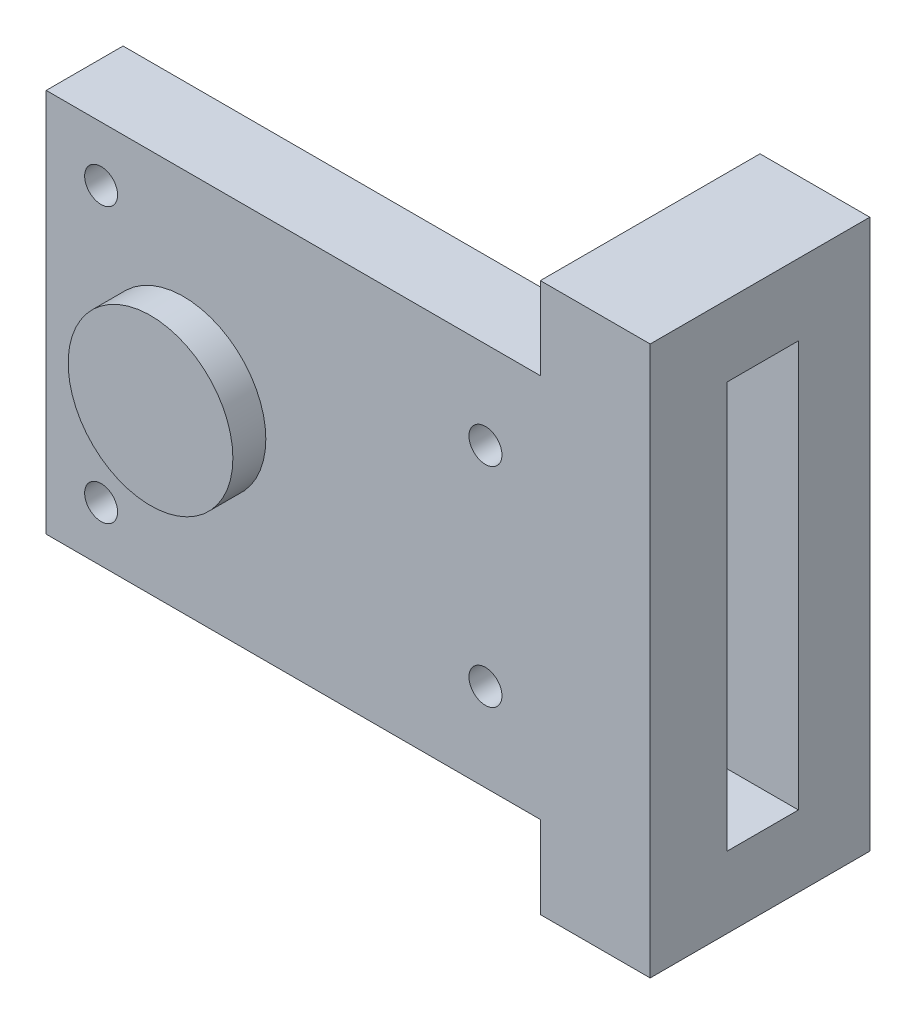
ISO-10303-21;
HEADER;
FILE_DESCRIPTION(('STEP AP214'),'2;1');
FILE_NAME('part.step','',(''),(''),'','','');
FILE_SCHEMA(('AUTOMOTIVE_DESIGN { 1 0 10303 214 1 1 1 1 }'));
ENDSEC;
DATA;
#1=APPLICATION_CONTEXT('core data for automotive mechanical design processes');
#2=APPLICATION_PROTOCOL_DEFINITION('international standard','automotive_design',2000,#1);
#3=PRODUCT_CONTEXT('',#1,'mechanical');
#4=PRODUCT('Part','Part','',(#3));
#5=PRODUCT_RELATED_PRODUCT_CATEGORY('part','',(#4));
#6=PRODUCT_DEFINITION_FORMATION('','',#4);
#7=PRODUCT_DEFINITION_CONTEXT('part definition',#1,'design');
#8=PRODUCT_DEFINITION('design','',#6,#7);
#9=PRODUCT_DEFINITION_SHAPE('','',#8);
#10=(LENGTH_UNIT() NAMED_UNIT(*) SI_UNIT(.MILLI.,.METRE.));
#11=(NAMED_UNIT(*) PLANE_ANGLE_UNIT() SI_UNIT($,.RADIAN.));
#12=(NAMED_UNIT(*) SI_UNIT($,.STERADIAN.) SOLID_ANGLE_UNIT());
#13=UNCERTAINTY_MEASURE_WITH_UNIT(LENGTH_MEASURE(1.E-05),#10,'distance_accuracy_value','');
#14=(GEOMETRIC_REPRESENTATION_CONTEXT(3) GLOBAL_UNCERTAINTY_ASSIGNED_CONTEXT((#13)) GLOBAL_UNIT_ASSIGNED_CONTEXT((#10,
#11,#12)) REPRESENTATION_CONTEXT('',''));
#15=CARTESIAN_POINT('',(0.,0.,0.));
#16=DIRECTION('',(0.,0.,1.));
#17=DIRECTION('',(1.,0.,0.));
#18=AXIS2_PLACEMENT_3D('',#15,#16,#17);
#19=CARTESIAN_POINT('',(0.,0.,0.));
#20=DIRECTION('',(0.,0.,1.));
#21=DIRECTION('',(1.,0.,0.));
#22=AXIS2_PLACEMENT_3D('',#19,#20,#21);
#23=PLANE('',#22);
#24=CARTESIAN_POINT('',(-80.0000000000005,5.96744875736022E-13,0.));
#25=DIRECTION('',(0.,0.,1.));
#26=DIRECTION('',(1.,0.,0.));
#27=AXIS2_PLACEMENT_3D('',#24,#25,#26);
#28=CIRCLE('',#27,4.25000000000001);
#29=CARTESIAN_POINT('',(-75.7500000000005,5.96744875736022E-13,0.));
#30=VERTEX_POINT('',#29);
#31=EDGE_CURVE('E546',#30,#30,#28,.T.);
#32=ORIENTED_EDGE('',*,*,#31,.T.);
#33=EDGE_LOOP('',(#32));
#34=FACE_BOUND('',#33,.T.);
#35=CARTESIAN_POINT('',(-52.5000000000001,-9.5,0.));
#36=DIRECTION('',(0.,0.,1.));
#37=DIRECTION('',(1.,0.,0.));
#38=AXIS2_PLACEMENT_3D('',#35,#36,#37);
#39=CIRCLE('',#38,1.5);
#40=CARTESIAN_POINT('',(-51.,-9.5,0.));
#41=VERTEX_POINT('',#40);
#42=EDGE_CURVE('E236',#41,#41,#39,.T.);
#43=ORIENTED_EDGE('',*,*,#42,.T.);
#44=EDGE_LOOP('',(#43));
#45=FACE_BOUND('',#44,.T.);
#46=CARTESIAN_POINT('',(-52.5000000000001,9.5,0.));
#47=DIRECTION('',(0.,0.,1.));
#48=DIRECTION('',(1.,0.,0.));
#49=AXIS2_PLACEMENT_3D('',#46,#47,#48);
#50=CIRCLE('',#49,1.5);
#51=CARTESIAN_POINT('',(-51.,9.5,0.));
#52=VERTEX_POINT('',#51);
#53=EDGE_CURVE('E268',#52,#52,#50,.T.);
#54=ORIENTED_EDGE('',*,*,#53,.T.);
#55=EDGE_LOOP('',(#54));
#56=FACE_BOUND('',#55,.T.);
#57=CARTESIAN_POINT('',(-87.5000000000001,12.5,0.));
#58=DIRECTION('',(0.,0.,1.));
#59=DIRECTION('',(1.,0.,0.));
#60=AXIS2_PLACEMENT_3D('',#57,#58,#59);
#61=CIRCLE('',#60,1.5);
#62=CARTESIAN_POINT('',(-86.,12.5,0.));
#63=VERTEX_POINT('',#62);
#64=EDGE_CURVE('E284',#63,#63,#61,.T.);
#65=ORIENTED_EDGE('',*,*,#64,.T.);
#66=EDGE_LOOP('',(#65));
#67=FACE_BOUND('',#66,.T.);
#68=CARTESIAN_POINT('',(-87.5000000000001,-12.5,0.));
#69=DIRECTION('',(0.,0.,1.));
#70=DIRECTION('',(1.,0.,0.));
#71=AXIS2_PLACEMENT_3D('',#68,#69,#70);
#72=CIRCLE('',#71,1.5);
#73=CARTESIAN_POINT('',(-86.,-12.5,0.));
#74=VERTEX_POINT('',#73);
#75=EDGE_CURVE('E242',#74,#74,#72,.F.);
#76=ORIENTED_EDGE('',*,*,#75,.F.);
#77=EDGE_LOOP('',(#76));
#78=FACE_BOUND('',#77,.T.);
#79=DIRECTION('',(1.,0.,0.));
#80=VECTOR('',#79,1.);
#81=CARTESIAN_POINT('',(-47.5000000000001,-18.5,0.));
#82=LINE('',#81,#80);
#83=CARTESIAN_POINT('',(-47.5000000000001,-18.5,0.));
#84=VERTEX_POINT('',#83);
#85=CARTESIAN_POINT('',(-37.5,-18.5,0.));
#86=VERTEX_POINT('',#85);
#87=EDGE_CURVE('E177',#84,#86,#82,.T.);
#88=ORIENTED_EDGE('',*,*,#87,.F.);
#89=DIRECTION('',(0.,1.,0.));
#90=VECTOR('',#89,1.);
#91=CARTESIAN_POINT('',(-47.5000000000001,25.,0.));
#92=LINE('',#91,#90);
#93=CARTESIAN_POINT('',(-47.5,-17.5,0.));
#94=VERTEX_POINT('',#93);
#95=EDGE_CURVE('E146',#84,#94,#92,.T.);
#96=ORIENTED_EDGE('',*,*,#95,.T.);
#97=DIRECTION('',(1.,0.,0.));
#98=VECTOR('',#97,1.);
#99=CARTESIAN_POINT('',(0.,-17.5,0.));
#100=LINE('',#99,#98);
#101=CARTESIAN_POINT('',(-92.5000000000001,-17.5,0.));
#102=VERTEX_POINT('',#101);
#103=EDGE_CURVE('E280',#102,#94,#100,.T.);
#104=ORIENTED_EDGE('',*,*,#103,.F.);
#105=DIRECTION('',(0.,-1.,0.));
#106=VECTOR('',#105,1.);
#107=CARTESIAN_POINT('',(-92.5000000000001,0.,0.));
#108=LINE('',#107,#106);
#109=CARTESIAN_POINT('',(-92.5000000000001,17.5,0.));
#110=VERTEX_POINT('',#109);
#111=EDGE_CURVE('E276',#110,#102,#108,.T.);
#112=ORIENTED_EDGE('',*,*,#111,.F.);
#113=DIRECTION('',(1.,0.,0.));
#114=VECTOR('',#113,1.);
#115=CARTESIAN_POINT('',(0.,17.5,0.));
#116=LINE('',#115,#114);
#117=CARTESIAN_POINT('',(-47.5000000000001,17.5,0.));
#118=VERTEX_POINT('',#117);
#119=EDGE_CURVE('E272',#110,#118,#116,.T.);
#120=ORIENTED_EDGE('',*,*,#119,.T.);
#121=CARTESIAN_POINT('',(-47.5000000000001,18.5,0.));
#122=VERTEX_POINT('',#121);
#123=EDGE_CURVE('E211',#118,#122,#92,.T.);
#124=ORIENTED_EDGE('',*,*,#123,.T.);
#125=DIRECTION('',(-1.,0.,0.));
#126=VECTOR('',#125,1.);
#127=CARTESIAN_POINT('',(-47.5000000000001,18.5,0.));
#128=LINE('',#127,#126);
#129=CARTESIAN_POINT('',(-37.5000000000001,18.5,0.));
#130=VERTEX_POINT('',#129);
#131=EDGE_CURVE('E195',#130,#122,#128,.T.);
#132=ORIENTED_EDGE('',*,*,#131,.F.);
#133=DIRECTION('',(0.,1.,0.));
#134=VECTOR('',#133,1.);
#135=CARTESIAN_POINT('',(-37.5000000000001,25.,0.));
#136=LINE('',#135,#134);
#137=EDGE_CURVE('E59',#86,#130,#136,.T.);
#138=ORIENTED_EDGE('',*,*,#137,.F.);
#139=EDGE_LOOP('',(#88,#96,#104,#112,#120,#124,#132,#138));
#140=FACE_BOUND('',#139,.T.);
#141=ADVANCED_FACE('F43',(#34,#45,#56,#67,#78,#140),#23,.F.);
#142=CARTESIAN_POINT('',(0.,17.5,7.));
#143=DIRECTION('',(0.,1.,0.));
#144=DIRECTION('',(0.,0.,1.));
#145=AXIS2_PLACEMENT_3D('',#142,#143,#144);
#146=PLANE('',#145);
#147=ORIENTED_EDGE('',*,*,#119,.F.);
#148=DIRECTION('',(0.,0.,-1.));
#149=VECTOR('',#148,1.);
#150=CARTESIAN_POINT('',(-92.5000000000001,17.5,7.));
#151=LINE('',#150,#149);
#152=CARTESIAN_POINT('',(-92.5000000000001,17.5,7.));
#153=VERTEX_POINT('',#152);
#154=EDGE_CURVE('E52',#153,#110,#151,.T.);
#155=ORIENTED_EDGE('',*,*,#154,.F.);
#156=DIRECTION('',(1.,0.,0.));
#157=VECTOR('',#156,1.);
#158=CARTESIAN_POINT('',(0.,17.5,7.));
#159=LINE('',#158,#157);
#160=CARTESIAN_POINT('',(-47.5000000000001,17.5,7.));
#161=VERTEX_POINT('',#160);
#162=EDGE_CURVE('E246',#153,#161,#159,.T.);
#163=ORIENTED_EDGE('',*,*,#162,.T.);
#164=DIRECTION('',(0.,0.,-1.));
#165=VECTOR('',#164,1.);
#166=CARTESIAN_POINT('',(-47.5000000000001,17.5,7.));
#167=LINE('',#166,#165);
#168=EDGE_CURVE('E11',#161,#118,#167,.T.);
#169=ORIENTED_EDGE('',*,*,#168,.T.);
#170=EDGE_LOOP('',(#147,#155,#163,#169));
#171=FACE_BOUND('',#170,.T.);
#172=ADVANCED_FACE('F307',(#171),#146,.T.);
#173=CARTESIAN_POINT('',(-92.5000000000001,0.,7.));
#174=DIRECTION('',(1.,0.,0.));
#175=DIRECTION('',(0.,0.,-1.));
#176=AXIS2_PLACEMENT_3D('',#173,#174,#175);
#177=PLANE('',#176);
#178=ORIENTED_EDGE('',*,*,#111,.T.);
#179=DIRECTION('',(0.,0.,-1.));
#180=VECTOR('',#179,1.);
#181=CARTESIAN_POINT('',(-92.5000000000001,-17.5,7.));
#182=LINE('',#181,#180);
#183=CARTESIAN_POINT('',(-92.5000000000001,-17.5,7.));
#184=VERTEX_POINT('',#183);
#185=EDGE_CURVE('E294',#184,#102,#182,.T.);
#186=ORIENTED_EDGE('',*,*,#185,.F.);
#187=DIRECTION('',(0.,-1.,0.));
#188=VECTOR('',#187,1.);
#189=CARTESIAN_POINT('',(-92.5000000000001,0.,7.));
#190=LINE('',#189,#188);
#191=EDGE_CURVE('E249',#153,#184,#190,.T.);
#192=ORIENTED_EDGE('',*,*,#191,.F.);
#193=ORIENTED_EDGE('',*,*,#154,.T.);
#194=EDGE_LOOP('',(#178,#186,#192,#193));
#195=FACE_BOUND('',#194,.T.);
#196=ADVANCED_FACE('F301',(#195),#177,.F.);
#197=CARTESIAN_POINT('',(-87.5000000000001,12.5,7.));
#198=DIRECTION('',(0.,0.,-1.));
#199=DIRECTION('',(-1.,0.,0.));
#200=AXIS2_PLACEMENT_3D('',#197,#198,#199);
#201=CYLINDRICAL_SURFACE('',#200,1.5);
#202=CARTESIAN_POINT('',(-87.5000000000001,12.5,7.));
#203=DIRECTION('',(0.,0.,1.));
#204=DIRECTION('',(1.,0.,0.));
#205=AXIS2_PLACEMENT_3D('',#202,#203,#204);
#206=CIRCLE('',#205,1.5);
#207=CARTESIAN_POINT('',(-86.,12.5,7.));
#208=VERTEX_POINT('',#207);
#209=EDGE_CURVE('E256',#208,#208,#206,.T.);
#210=ORIENTED_EDGE('',*,*,#209,.T.);
#211=EDGE_LOOP('',(#210));
#212=FACE_BOUND('',#211,.T.);
#213=ORIENTED_EDGE('',*,*,#64,.F.);
#214=EDGE_LOOP('',(#213));
#215=FACE_BOUND('',#214,.T.);
#216=ADVANCED_FACE('F335',(#212,#215),#201,.F.);
#217=CARTESIAN_POINT('',(0.,-17.5,7.));
#218=DIRECTION('',(0.,1.,0.));
#219=DIRECTION('',(0.,0.,1.));
#220=AXIS2_PLACEMENT_3D('',#217,#218,#219);
#221=PLANE('',#220);
#222=ORIENTED_EDGE('',*,*,#103,.T.);
#223=DIRECTION('',(0.,0.,-1.));
#224=VECTOR('',#223,1.);
#225=CARTESIAN_POINT('',(-47.5,-17.5,7.));
#226=LINE('',#225,#224);
#227=CARTESIAN_POINT('',(-47.5,-17.5,7.));
#228=VERTEX_POINT('',#227);
#229=EDGE_CURVE('E264',#228,#94,#226,.T.);
#230=ORIENTED_EDGE('',*,*,#229,.F.);
#231=DIRECTION('',(1.,0.,0.));
#232=VECTOR('',#231,1.);
#233=CARTESIAN_POINT('',(0.,-17.5,7.));
#234=LINE('',#233,#232);
#235=EDGE_CURVE('E253',#184,#228,#234,.T.);
#236=ORIENTED_EDGE('',*,*,#235,.F.);
#237=ORIENTED_EDGE('',*,*,#185,.T.);
#238=EDGE_LOOP('',(#222,#230,#236,#237));
#239=FACE_BOUND('',#238,.T.);
#240=ADVANCED_FACE('F332',(#239),#221,.F.);
#241=CARTESIAN_POINT('',(-52.5000000000001,9.5,7.));
#242=DIRECTION('',(0.,0.,-1.));
#243=DIRECTION('',(-1.,0.,0.));
#244=AXIS2_PLACEMENT_3D('',#241,#242,#243);
#245=CYLINDRICAL_SURFACE('',#244,1.5);
#246=CARTESIAN_POINT('',(-52.5000000000001,9.5,7.));
#247=DIRECTION('',(0.,0.,1.));
#248=DIRECTION('',(1.,0.,0.));
#249=AXIS2_PLACEMENT_3D('',#246,#247,#248);
#250=CIRCLE('',#249,1.5);
#251=CARTESIAN_POINT('',(-51.,9.5,7.));
#252=VERTEX_POINT('',#251);
#253=EDGE_CURVE('E241',#252,#252,#250,.T.);
#254=ORIENTED_EDGE('',*,*,#253,.T.);
#255=EDGE_LOOP('',(#254));
#256=FACE_BOUND('',#255,.T.);
#257=ORIENTED_EDGE('',*,*,#53,.F.);
#258=EDGE_LOOP('',(#257));
#259=FACE_BOUND('',#258,.T.);
#260=ADVANCED_FACE('F334',(#256,#259),#245,.F.);
#261=CARTESIAN_POINT('',(-52.5000000000001,-9.5,7.));
#262=DIRECTION('',(0.,0.,-1.));
#263=DIRECTION('',(-1.,0.,0.));
#264=AXIS2_PLACEMENT_3D('',#261,#262,#263);
#265=CYLINDRICAL_SURFACE('',#264,1.5);
#266=CARTESIAN_POINT('',(-52.5000000000001,-9.5,7.));
#267=DIRECTION('',(0.,0.,1.));
#268=DIRECTION('',(1.,0.,0.));
#269=AXIS2_PLACEMENT_3D('',#266,#267,#268);
#270=CIRCLE('',#269,1.5);
#271=CARTESIAN_POINT('',(-51.,-9.5,7.));
#272=VERTEX_POINT('',#271);
#273=EDGE_CURVE('E237',#272,#272,#270,.T.);
#274=ORIENTED_EDGE('',*,*,#273,.T.);
#275=EDGE_LOOP('',(#274));
#276=FACE_BOUND('',#275,.T.);
#277=ORIENTED_EDGE('',*,*,#42,.F.);
#278=EDGE_LOOP('',(#277));
#279=FACE_BOUND('',#278,.T.);
#280=ADVANCED_FACE('F45',(#276,#279),#265,.F.);
#281=CARTESIAN_POINT('',(-87.5000000000001,-12.5,7.));
#282=DIRECTION('',(0.,0.,-1.));
#283=DIRECTION('',(-1.,0.,0.));
#284=AXIS2_PLACEMENT_3D('',#281,#282,#283);
#285=CYLINDRICAL_SURFACE('',#284,1.5);
#286=CARTESIAN_POINT('',(-87.5000000000001,-12.5,7.));
#287=DIRECTION('',(0.,0.,1.));
#288=DIRECTION('',(1.,0.,0.));
#289=AXIS2_PLACEMENT_3D('',#286,#287,#288);
#290=CIRCLE('',#289,1.5);
#291=CARTESIAN_POINT('',(-86.,-12.5,7.));
#292=VERTEX_POINT('',#291);
#293=EDGE_CURVE('E260',#292,#292,#290,.F.);
#294=ORIENTED_EDGE('',*,*,#293,.F.);
#295=EDGE_LOOP('',(#294));
#296=FACE_BOUND('',#295,.T.);
#297=ORIENTED_EDGE('',*,*,#75,.T.);
#298=EDGE_LOOP('',(#297));
#299=FACE_BOUND('',#298,.T.);
#300=ADVANCED_FACE('F357',(#296,#299),#285,.F.);
#301=CARTESIAN_POINT('',(0.,0.,7.));
#302=DIRECTION('',(0.,0.,1.));
#303=DIRECTION('',(1.,0.,0.));
#304=AXIS2_PLACEMENT_3D('',#301,#302,#303);
#305=PLANE('',#304);
#306=CARTESIAN_POINT('',(-80.0000000000005,5.96744875736022E-13,7.));
#307=DIRECTION('',(0.,0.,1.));
#308=DIRECTION('',(1.,0.,0.));
#309=AXIS2_PLACEMENT_3D('',#306,#307,#308);
#310=CIRCLE('',#309,7.50000000000001);
#311=CARTESIAN_POINT('',(-72.5000000000005,5.96744875736022E-13,7.));
#312=VERTEX_POINT('',#311);
#313=EDGE_CURVE('E170',#312,#312,#310,.T.);
#314=ORIENTED_EDGE('',*,*,#313,.F.);
#315=EDGE_LOOP('',(#314));
#316=FACE_BOUND('',#315,.T.);
#317=ORIENTED_EDGE('',*,*,#273,.F.);
#318=EDGE_LOOP('',(#317));
#319=FACE_BOUND('',#318,.T.);
#320=ORIENTED_EDGE('',*,*,#253,.F.);
#321=EDGE_LOOP('',(#320));
#322=FACE_BOUND('',#321,.T.);
#323=ORIENTED_EDGE('',*,*,#235,.T.);
#324=DIRECTION('',(0.,-1.,0.));
#325=VECTOR('',#324,1.);
#326=CARTESIAN_POINT('',(-47.5000000000001,25.,7.));
#327=LINE('',#326,#325);
#328=CARTESIAN_POINT('',(-47.5,-25.,6.99999999999999));
#329=VERTEX_POINT('',#328);
#330=EDGE_CURVE('E145',#228,#329,#327,.T.);
#331=ORIENTED_EDGE('',*,*,#330,.T.);
#332=DIRECTION('',(-1.,0.,0.));
#333=VECTOR('',#332,1.);
#334=CARTESIAN_POINT('',(-37.5,-25.,6.99999999999999));
#335=LINE('',#334,#333);
#336=CARTESIAN_POINT('',(-37.5,-25.,6.99999999999999));
#337=VERTEX_POINT('',#336);
#338=EDGE_CURVE('E223',#337,#329,#335,.T.);
#339=ORIENTED_EDGE('',*,*,#338,.F.);
#340=DIRECTION('',(0.,-1.,0.));
#341=VECTOR('',#340,1.);
#342=CARTESIAN_POINT('',(-37.5000000000001,25.,7.));
#343=LINE('',#342,#341);
#344=CARTESIAN_POINT('',(-37.5000000000001,25.,7.));
#345=VERTEX_POINT('',#344);
#346=EDGE_CURVE('E217',#345,#337,#343,.T.);
#347=ORIENTED_EDGE('',*,*,#346,.F.);
#348=DIRECTION('',(-1.,0.,0.));
#349=VECTOR('',#348,1.);
#350=CARTESIAN_POINT('',(-37.5000000000001,25.,7.));
#351=LINE('',#350,#349);
#352=CARTESIAN_POINT('',(-47.5000000000001,25.,7.));
#353=VERTEX_POINT('',#352);
#354=EDGE_CURVE('E233',#345,#353,#351,.T.);
#355=ORIENTED_EDGE('',*,*,#354,.T.);
#356=EDGE_CURVE('E140',#353,#161,#327,.T.);
#357=ORIENTED_EDGE('',*,*,#356,.T.);
#358=ORIENTED_EDGE('',*,*,#162,.F.);
#359=ORIENTED_EDGE('',*,*,#191,.T.);
#360=EDGE_LOOP('',(#323,#331,#339,#347,#355,#357,#358,#359));
#361=FACE_BOUND('',#360,.T.);
#362=ORIENTED_EDGE('',*,*,#209,.F.);
#363=EDGE_LOOP('',(#362));
#364=FACE_BOUND('',#363,.T.);
#365=ORIENTED_EDGE('',*,*,#293,.T.);
#366=EDGE_LOOP('',(#365));
#367=FACE_BOUND('',#366,.T.);
#368=ADVANCED_FACE('F309',(#316,#319,#322,#361,#364,#367),#305,.T.);
#369=CARTESIAN_POINT('',(-47.5,0.,0.));
#370=DIRECTION('',(-1.,0.,0.));
#371=DIRECTION('',(0.,-1.,0.));
#372=AXIS2_PLACEMENT_3D('',#369,#370,#371);
#373=PLANE('',#372);
#374=ORIENTED_EDGE('',*,*,#168,.F.);
#375=ORIENTED_EDGE('',*,*,#356,.F.);
#376=DIRECTION('',(0.,0.,1.));
#377=VECTOR('',#376,1.);
#378=CARTESIAN_POINT('',(-47.5000000000001,25.,0.));
#379=LINE('',#378,#377);
#380=CARTESIAN_POINT('',(-47.5000000000001,25.,-13.));
#381=VERTEX_POINT('',#380);
#382=EDGE_CURVE('E132',#381,#353,#379,.T.);
#383=ORIENTED_EDGE('',*,*,#382,.F.);
#384=DIRECTION('',(0.,1.,0.));
#385=VECTOR('',#384,1.);
#386=CARTESIAN_POINT('',(-47.5000000000001,25.,-13.));
#387=LINE('',#386,#385);
#388=CARTESIAN_POINT('',(-47.5000000000001,-25.,-13.));
#389=VERTEX_POINT('',#388);
#390=EDGE_CURVE('E138',#389,#381,#387,.T.);
#391=ORIENTED_EDGE('',*,*,#390,.F.);
#392=DIRECTION('',(0.,0.,-1.));
#393=VECTOR('',#392,1.);
#394=CARTESIAN_POINT('',(-47.5,-25.,0.));
#395=LINE('',#394,#393);
#396=EDGE_CURVE('E214',#329,#389,#395,.T.);
#397=ORIENTED_EDGE('',*,*,#396,.F.);
#398=ORIENTED_EDGE('',*,*,#330,.F.);
#399=ORIENTED_EDGE('',*,*,#229,.T.);
#400=ORIENTED_EDGE('',*,*,#95,.F.);
#401=DIRECTION('',(0.,0.,1.));
#402=VECTOR('',#401,1.);
#403=CARTESIAN_POINT('',(-47.5000000000001,-18.5,-6.5));
#404=LINE('',#403,#402);
#405=CARTESIAN_POINT('',(-47.5000000000001,-18.5,-6.5));
#406=VERTEX_POINT('',#405);
#407=EDGE_CURVE('E191',#406,#84,#404,.T.);
#408=ORIENTED_EDGE('',*,*,#407,.F.);
#409=DIRECTION('',(0.,1.,0.));
#410=VECTOR('',#409,1.);
#411=CARTESIAN_POINT('',(-47.5000000000001,25.,-6.5));
#412=LINE('',#411,#410);
#413=CARTESIAN_POINT('',(-47.5000000000001,18.5,-6.5));
#414=VERTEX_POINT('',#413);
#415=EDGE_CURVE('E167',#406,#414,#412,.T.);
#416=ORIENTED_EDGE('',*,*,#415,.T.);
#417=DIRECTION('',(0.,0.,1.));
#418=VECTOR('',#417,1.);
#419=CARTESIAN_POINT('',(-47.5000000000001,18.5,-6.5));
#420=LINE('',#419,#418);
#421=EDGE_CURVE('E200',#414,#122,#420,.T.);
#422=ORIENTED_EDGE('',*,*,#421,.T.);
#423=ORIENTED_EDGE('',*,*,#123,.F.);
#424=EDGE_LOOP('',(#374,#375,#383,#391,#397,#398,#399,#400,#408,#416,#422,#423));
#425=FACE_BOUND('',#424,.T.);
#426=ADVANCED_FACE('F135',(#425),#373,.T.);
#427=CARTESIAN_POINT('',(-37.5000000000001,25.,0.));
#428=DIRECTION('',(0.,-1.,0.));
#429=DIRECTION('',(1.,0.,0.));
#430=AXIS2_PLACEMENT_3D('',#427,#428,#429);
#431=PLANE('',#430);
#432=ORIENTED_EDGE('',*,*,#382,.T.);
#433=ORIENTED_EDGE('',*,*,#354,.F.);
#434=DIRECTION('',(0.,0.,1.));
#435=VECTOR('',#434,1.);
#436=CARTESIAN_POINT('',(-37.5000000000001,25.,0.));
#437=LINE('',#436,#435);
#438=CARTESIAN_POINT('',(-37.5000000000001,25.,-13.));
#439=VERTEX_POINT('',#438);
#440=EDGE_CURVE('E151',#439,#345,#437,.T.);
#441=ORIENTED_EDGE('',*,*,#440,.F.);
#442=DIRECTION('',(1.,0.,0.));
#443=VECTOR('',#442,1.);
#444=CARTESIAN_POINT('',(-47.5000000000001,25.,-13.));
#445=LINE('',#444,#443);
#446=EDGE_CURVE('E149',#381,#439,#445,.T.);
#447=ORIENTED_EDGE('',*,*,#446,.F.);
#448=EDGE_LOOP('',(#432,#433,#441,#447));
#449=FACE_BOUND('',#448,.T.);
#450=ADVANCED_FACE('F150',(#449),#431,.F.);
#451=CARTESIAN_POINT('',(-37.5,-25.,0.));
#452=DIRECTION('',(0.,1.,0.));
#453=DIRECTION('',(0.,0.,1.));
#454=AXIS2_PLACEMENT_3D('',#451,#452,#453);
#455=PLANE('',#454);
#456=ORIENTED_EDGE('',*,*,#396,.T.);
#457=DIRECTION('',(-1.,0.,0.));
#458=VECTOR('',#457,1.);
#459=CARTESIAN_POINT('',(-47.5000000000001,-25.,-13.));
#460=LINE('',#459,#458);
#461=CARTESIAN_POINT('',(-37.5000000000001,-25.,-13.));
#462=VERTEX_POINT('',#461);
#463=EDGE_CURVE('E161',#462,#389,#460,.T.);
#464=ORIENTED_EDGE('',*,*,#463,.F.);
#465=DIRECTION('',(0.,0.,-1.));
#466=VECTOR('',#465,1.);
#467=CARTESIAN_POINT('',(-37.5,-25.,0.));
#468=LINE('',#467,#466);
#469=EDGE_CURVE('E220',#337,#462,#468,.T.);
#470=ORIENTED_EDGE('',*,*,#469,.F.);
#471=ORIENTED_EDGE('',*,*,#338,.T.);
#472=EDGE_LOOP('',(#456,#464,#470,#471));
#473=FACE_BOUND('',#472,.T.);
#474=ADVANCED_FACE('F317',(#473),#455,.F.);
#475=CARTESIAN_POINT('',(-37.5,0.,0.));
#476=DIRECTION('',(-1.,0.,0.));
#477=DIRECTION('',(0.,-1.,0.));
#478=AXIS2_PLACEMENT_3D('',#475,#476,#477);
#479=PLANE('',#478);
#480=DIRECTION('',(0.,0.,1.));
#481=VECTOR('',#480,1.);
#482=CARTESIAN_POINT('',(-37.5,18.5,-6.5));
#483=LINE('',#482,#481);
#484=CARTESIAN_POINT('',(-37.5000000000001,18.5,-6.5));
#485=VERTEX_POINT('',#484);
#486=EDGE_CURVE('E207',#485,#130,#483,.T.);
#487=ORIENTED_EDGE('',*,*,#486,.F.);
#488=DIRECTION('',(0.,-1.,0.));
#489=VECTOR('',#488,1.);
#490=CARTESIAN_POINT('',(-37.5000000000001,25.,-6.5));
#491=LINE('',#490,#489);
#492=CARTESIAN_POINT('',(-37.5,-18.5,-6.5));
#493=VERTEX_POINT('',#492);
#494=EDGE_CURVE('E163',#485,#493,#491,.T.);
#495=ORIENTED_EDGE('',*,*,#494,.T.);
#496=DIRECTION('',(0.,0.,1.));
#497=VECTOR('',#496,1.);
#498=CARTESIAN_POINT('',(-37.5,-18.5,-6.5));
#499=LINE('',#498,#497);
#500=EDGE_CURVE('E186',#493,#86,#499,.T.);
#501=ORIENTED_EDGE('',*,*,#500,.T.);
#502=ORIENTED_EDGE('',*,*,#137,.T.);
#503=EDGE_LOOP('',(#487,#495,#501,#502));
#504=FACE_BOUND('',#503,.T.);
#505=ORIENTED_EDGE('',*,*,#469,.T.);
#506=DIRECTION('',(0.,-1.,0.));
#507=VECTOR('',#506,1.);
#508=CARTESIAN_POINT('',(-37.5000000000001,25.,-13.));
#509=LINE('',#508,#507);
#510=EDGE_CURVE('E156',#439,#462,#509,.T.);
#511=ORIENTED_EDGE('',*,*,#510,.F.);
#512=ORIENTED_EDGE('',*,*,#440,.T.);
#513=ORIENTED_EDGE('',*,*,#346,.T.);
#514=EDGE_LOOP('',(#505,#511,#512,#513));
#515=FACE_BOUND('',#514,.T.);
#516=ADVANCED_FACE('F315',(#504,#515),#479,.F.);
#517=CARTESIAN_POINT('',(-47.5000000000001,18.5,-6.5));
#518=DIRECTION('',(0.,1.,0.));
#519=DIRECTION('',(-1.,0.,0.));
#520=AXIS2_PLACEMENT_3D('',#517,#518,#519);
#521=PLANE('',#520);
#522=ORIENTED_EDGE('',*,*,#131,.T.);
#523=ORIENTED_EDGE('',*,*,#421,.F.);
#524=DIRECTION('',(-1.,0.,0.));
#525=VECTOR('',#524,1.);
#526=CARTESIAN_POINT('',(-47.5000000000001,18.5,-6.5));
#527=LINE('',#526,#525);
#528=EDGE_CURVE('E196',#485,#414,#527,.T.);
#529=ORIENTED_EDGE('',*,*,#528,.F.);
#530=ORIENTED_EDGE('',*,*,#486,.T.);
#531=EDGE_LOOP('',(#522,#523,#529,#530));
#532=FACE_BOUND('',#531,.T.);
#533=ADVANCED_FACE('F323',(#532),#521,.F.);
#534=CARTESIAN_POINT('',(-47.5000000000001,-18.5,-6.5));
#535=DIRECTION('',(0.,-1.,0.));
#536=DIRECTION('',(1.,0.,0.));
#537=AXIS2_PLACEMENT_3D('',#534,#535,#536);
#538=PLANE('',#537);
#539=ORIENTED_EDGE('',*,*,#87,.T.);
#540=ORIENTED_EDGE('',*,*,#500,.F.);
#541=DIRECTION('',(1.,0.,0.));
#542=VECTOR('',#541,1.);
#543=CARTESIAN_POINT('',(-47.5000000000001,-18.5,-6.5));
#544=LINE('',#543,#542);
#545=EDGE_CURVE('E182',#406,#493,#544,.T.);
#546=ORIENTED_EDGE('',*,*,#545,.F.);
#547=ORIENTED_EDGE('',*,*,#407,.T.);
#548=EDGE_LOOP('',(#539,#540,#546,#547));
#549=FACE_BOUND('',#548,.T.);
#550=ADVANCED_FACE('F330',(#549),#538,.F.);
#551=CARTESIAN_POINT('',(0.,0.,-6.5));
#552=DIRECTION('',(0.,0.,1.));
#553=DIRECTION('',(1.,0.,0.));
#554=AXIS2_PLACEMENT_3D('',#551,#552,#553);
#555=PLANE('',#554);
#556=ORIENTED_EDGE('',*,*,#528,.T.);
#557=ORIENTED_EDGE('',*,*,#415,.F.);
#558=ORIENTED_EDGE('',*,*,#545,.T.);
#559=ORIENTED_EDGE('',*,*,#494,.F.);
#560=EDGE_LOOP('',(#556,#557,#558,#559));
#561=FACE_BOUND('',#560,.T.);
#562=ADVANCED_FACE('F327',(#561),#555,.T.);
#563=CARTESIAN_POINT('',(0.,0.,-13.));
#564=DIRECTION('',(0.,0.,1.));
#565=DIRECTION('',(1.,0.,0.));
#566=AXIS2_PLACEMENT_3D('',#563,#564,#565);
#567=PLANE('',#566);
#568=ORIENTED_EDGE('',*,*,#390,.T.);
#569=ORIENTED_EDGE('',*,*,#446,.T.);
#570=ORIENTED_EDGE('',*,*,#510,.T.);
#571=ORIENTED_EDGE('',*,*,#463,.T.);
#572=EDGE_LOOP('',(#568,#569,#570,#571));
#573=FACE_BOUND('',#572,.T.);
#574=ADVANCED_FACE('F159',(#573),#567,.F.);
#575=CARTESIAN_POINT('',(-80.0000000000005,5.96744875736022E-13,10.));
#576=DIRECTION('',(0.,0.,-1.));
#577=DIRECTION('',(-1.,0.,0.));
#578=AXIS2_PLACEMENT_3D('',#575,#576,#577);
#579=CYLINDRICAL_SURFACE('',#578,7.50000000000001);
#580=CARTESIAN_POINT('',(-80.0000000000005,5.96744875736022E-13,10.));
#581=DIRECTION('',(0.,0.,1.));
#582=DIRECTION('',(1.,0.,0.));
#583=AXIS2_PLACEMENT_3D('',#580,#581,#582);
#584=CIRCLE('',#583,7.50000000000001);
#585=CARTESIAN_POINT('',(-72.5000000000005,5.96744875736022E-13,10.));
#586=VERTEX_POINT('',#585);
#587=EDGE_CURVE('E180',#586,#586,#584,.T.);
#588=ORIENTED_EDGE('',*,*,#587,.F.);
#589=EDGE_LOOP('',(#588));
#590=FACE_BOUND('',#589,.T.);
#591=ORIENTED_EDGE('',*,*,#313,.T.);
#592=EDGE_LOOP('',(#591));
#593=FACE_BOUND('',#592,.T.);
#594=ADVANCED_FACE('F482',(#590,#593),#579,.T.);
#595=CARTESIAN_POINT('',(-80.0000000000005,5.96744875736022E-13,10.));
#596=DIRECTION('',(0.,0.,1.));
#597=DIRECTION('',(1.,0.,0.));
#598=AXIS2_PLACEMENT_3D('',#595,#596,#597);
#599=PLANE('',#598);
#600=ORIENTED_EDGE('',*,*,#587,.T.);
#601=EDGE_LOOP('',(#600));
#602=FACE_BOUND('',#601,.T.);
#603=ADVANCED_FACE('F499',(#602),#599,.T.);
#604=CARTESIAN_POINT('',(-80.0000000000005,5.96744875736022E-13,6.));
#605=DIRECTION('',(0.,0.,-1.));
#606=DIRECTION('',(-1.,0.,0.));
#607=AXIS2_PLACEMENT_3D('',#604,#605,#606);
#608=CYLINDRICAL_SURFACE('',#607,4.25000000000001);
#609=CARTESIAN_POINT('',(-80.0000000000005,5.96744875736022E-13,6.));
#610=DIRECTION('',(0.,0.,1.));
#611=DIRECTION('',(1.,0.,0.));
#612=AXIS2_PLACEMENT_3D('',#609,#610,#611);
#613=CIRCLE('',#612,4.25000000000001);
#614=CARTESIAN_POINT('',(-75.7500000000005,5.96744875736022E-13,6.));
#615=VERTEX_POINT('',#614);
#616=EDGE_CURVE('E544',#615,#615,#613,.T.);
#617=ORIENTED_EDGE('',*,*,#616,.T.);
#618=EDGE_LOOP('',(#617));
#619=FACE_BOUND('',#618,.T.);
#620=ORIENTED_EDGE('',*,*,#31,.F.);
#621=EDGE_LOOP('',(#620));
#622=FACE_BOUND('',#621,.T.);
#623=ADVANCED_FACE('F508',(#619,#622),#608,.F.);
#624=CARTESIAN_POINT('',(0.,0.,6.));
#625=DIRECTION('',(0.,0.,1.));
#626=DIRECTION('',(1.,0.,0.));
#627=AXIS2_PLACEMENT_3D('',#624,#625,#626);
#628=PLANE('',#627);
#629=ORIENTED_EDGE('',*,*,#616,.F.);
#630=EDGE_LOOP('',(#629));
#631=FACE_BOUND('',#630,.T.);
#632=ADVANCED_FACE('F525',(#631),#628,.F.);
#633=CLOSED_SHELL('',(#141,#172,#196,#216,#240,#260,#280,#300,#368,#426,#450,#474,#516,#533,
#550,#562,#574,#594,#603,#623,#632));
#634=MANIFOLD_SOLID_BREP('B2',#633);
#635=ADVANCED_BREP_SHAPE_REPRESENTATION('',(#18,#634),#14);
#636=SHAPE_DEFINITION_REPRESENTATION(#9,#635);
ENDSEC;
END-ISO-10303-21;
